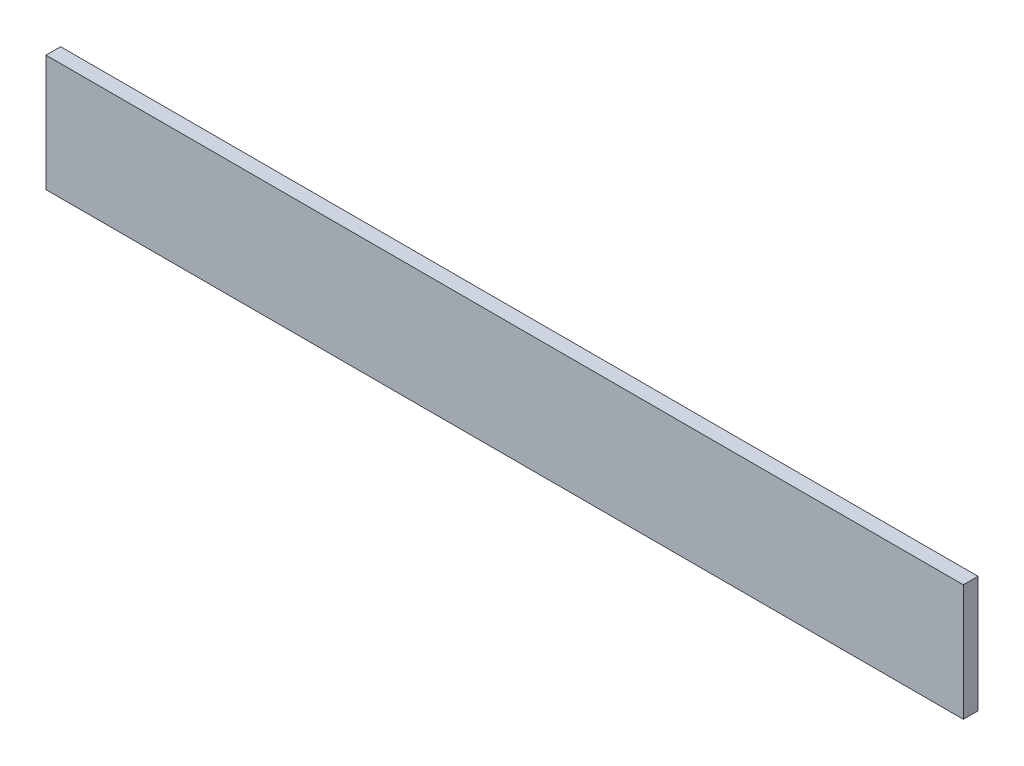
ISO-10303-21;
HEADER;
FILE_DESCRIPTION(('STEP AP214'),'2;1');
FILE_NAME('part.step','',(''),(''),'','','');
FILE_SCHEMA(('AUTOMOTIVE_DESIGN { 1 0 10303 214 1 1 1 1 }'));
ENDSEC;
DATA;
#1=APPLICATION_CONTEXT('core data for automotive mechanical design processes');
#2=APPLICATION_PROTOCOL_DEFINITION('international standard','automotive_design',2000,#1);
#3=PRODUCT_CONTEXT('',#1,'mechanical');
#4=PRODUCT('Part','Part','',(#3));
#5=PRODUCT_RELATED_PRODUCT_CATEGORY('part','',(#4));
#6=PRODUCT_DEFINITION_FORMATION('','',#4);
#7=PRODUCT_DEFINITION_CONTEXT('part definition',#1,'design');
#8=PRODUCT_DEFINITION('design','',#6,#7);
#9=PRODUCT_DEFINITION_SHAPE('','',#8);
#10=(LENGTH_UNIT() NAMED_UNIT(*) SI_UNIT(.MILLI.,.METRE.));
#11=(NAMED_UNIT(*) PLANE_ANGLE_UNIT() SI_UNIT($,.RADIAN.));
#12=(NAMED_UNIT(*) SI_UNIT($,.STERADIAN.) SOLID_ANGLE_UNIT());
#13=UNCERTAINTY_MEASURE_WITH_UNIT(LENGTH_MEASURE(1.E-05),#10,'distance_accuracy_value','');
#14=(GEOMETRIC_REPRESENTATION_CONTEXT(3) GLOBAL_UNCERTAINTY_ASSIGNED_CONTEXT((#13)) GLOBAL_UNIT_ASSIGNED_CONTEXT((#10,
#11,#12)) REPRESENTATION_CONTEXT('',''));
#15=CARTESIAN_POINT('',(0.,0.,0.));
#16=DIRECTION('',(0.,0.,1.));
#17=DIRECTION('',(1.,0.,0.));
#18=AXIS2_PLACEMENT_3D('',#15,#16,#17);
#19=CARTESIAN_POINT('',(50.,0.,0.));
#20=DIRECTION('',(0.,0.,-1.));
#21=DIRECTION('',(-1.,0.,0.));
#22=AXIS2_PLACEMENT_3D('',#19,#20,#21);
#23=PLANE('',#22);
#24=DIRECTION('',(0.,-1.,0.));
#25=VECTOR('',#24,1.);
#26=CARTESIAN_POINT('',(0.,0.,0.));
#27=LINE('',#26,#25);
#28=CARTESIAN_POINT('',(0.,6.35,0.));
#29=VERTEX_POINT('',#28);
#30=CARTESIAN_POINT('',(0.,0.,0.));
#31=VERTEX_POINT('',#30);
#32=EDGE_CURVE('E95',#29,#31,#27,.T.);
#33=ORIENTED_EDGE('',*,*,#32,.T.);
#34=DIRECTION('',(-1.,0.,0.));
#35=VECTOR('',#34,1.);
#36=CARTESIAN_POINT('',(50.,0.,0.));
#37=LINE('',#36,#35);
#38=CARTESIAN_POINT('',(50.,0.,0.));
#39=VERTEX_POINT('',#38);
#40=EDGE_CURVE('E11',#39,#31,#37,.T.);
#41=ORIENTED_EDGE('',*,*,#40,.F.);
#42=DIRECTION('',(0.,-1.,0.));
#43=VECTOR('',#42,1.);
#44=CARTESIAN_POINT('',(50.,0.,0.));
#45=LINE('',#44,#43);
#46=CARTESIAN_POINT('',(50.,6.35,0.));
#47=VERTEX_POINT('',#46);
#48=EDGE_CURVE('E83',#47,#39,#45,.T.);
#49=ORIENTED_EDGE('',*,*,#48,.F.);
#50=DIRECTION('',(-1.,0.,0.));
#51=VECTOR('',#50,1.);
#52=CARTESIAN_POINT('',(50.,6.35,0.));
#53=LINE('',#52,#51);
#54=EDGE_CURVE('E91',#47,#29,#53,.T.);
#55=ORIENTED_EDGE('',*,*,#54,.T.);
#56=EDGE_LOOP('',(#33,#41,#49,#55));
#57=FACE_BOUND('',#56,.T.);
#58=ADVANCED_FACE('F32',(#57),#23,.F.);
#59=CARTESIAN_POINT('',(50.,0.,0.));
#60=DIRECTION('',(0.,1.,0.));
#61=DIRECTION('',(0.,0.,1.));
#62=AXIS2_PLACEMENT_3D('',#59,#60,#61);
#63=PLANE('',#62);
#64=DIRECTION('',(0.,0.,-1.));
#65=VECTOR('',#64,1.);
#66=CARTESIAN_POINT('',(0.,0.,0.));
#67=LINE('',#66,#65);
#68=CARTESIAN_POINT('',(0.,0.,-0.8));
#69=VERTEX_POINT('',#68);
#70=EDGE_CURVE('E87',#31,#69,#67,.T.);
#71=ORIENTED_EDGE('',*,*,#70,.T.);
#72=DIRECTION('',(-1.,0.,0.));
#73=VECTOR('',#72,1.);
#74=CARTESIAN_POINT('',(50.,0.,-0.8));
#75=LINE('',#74,#73);
#76=CARTESIAN_POINT('',(50.,0.,-0.8));
#77=VERTEX_POINT('',#76);
#78=EDGE_CURVE('E40',#77,#69,#75,.T.);
#79=ORIENTED_EDGE('',*,*,#78,.F.);
#80=DIRECTION('',(0.,0.,-1.));
#81=VECTOR('',#80,1.);
#82=CARTESIAN_POINT('',(50.,0.,0.));
#83=LINE('',#82,#81);
#84=EDGE_CURVE('E78',#39,#77,#83,.T.);
#85=ORIENTED_EDGE('',*,*,#84,.F.);
#86=ORIENTED_EDGE('',*,*,#40,.T.);
#87=EDGE_LOOP('',(#71,#79,#85,#86));
#88=FACE_BOUND('',#87,.T.);
#89=ADVANCED_FACE('F86',(#88),#63,.F.);
#90=CARTESIAN_POINT('',(50.,0.,-0.8));
#91=DIRECTION('',(0.,0.,1.));
#92=DIRECTION('',(1.,0.,0.));
#93=AXIS2_PLACEMENT_3D('',#90,#91,#92);
#94=PLANE('',#93);
#95=DIRECTION('',(0.,1.,0.));
#96=VECTOR('',#95,1.);
#97=CARTESIAN_POINT('',(0.,0.,-0.8));
#98=LINE('',#97,#96);
#99=CARTESIAN_POINT('',(0.,6.35,-0.8));
#100=VERTEX_POINT('',#99);
#101=EDGE_CURVE('E65',#69,#100,#98,.T.);
#102=ORIENTED_EDGE('',*,*,#101,.T.);
#103=DIRECTION('',(-1.,0.,0.));
#104=VECTOR('',#103,1.);
#105=CARTESIAN_POINT('',(50.,6.35,-0.8));
#106=LINE('',#105,#104);
#107=CARTESIAN_POINT('',(50.,6.35,-0.8));
#108=VERTEX_POINT('',#107);
#109=EDGE_CURVE('E88',#108,#100,#106,.T.);
#110=ORIENTED_EDGE('',*,*,#109,.F.);
#111=DIRECTION('',(0.,1.,0.));
#112=VECTOR('',#111,1.);
#113=CARTESIAN_POINT('',(50.,0.,-0.8));
#114=LINE('',#113,#112);
#115=EDGE_CURVE('E81',#77,#108,#114,.T.);
#116=ORIENTED_EDGE('',*,*,#115,.F.);
#117=ORIENTED_EDGE('',*,*,#78,.T.);
#118=EDGE_LOOP('',(#102,#110,#116,#117));
#119=FACE_BOUND('',#118,.T.);
#120=ADVANCED_FACE('F89',(#119),#94,.F.);
#121=CARTESIAN_POINT('',(50.,6.35,0.));
#122=DIRECTION('',(0.,-1.,0.));
#123=DIRECTION('',(0.,0.,-1.));
#124=AXIS2_PLACEMENT_3D('',#121,#122,#123);
#125=PLANE('',#124);
#126=DIRECTION('',(0.,0.,1.));
#127=VECTOR('',#126,1.);
#128=CARTESIAN_POINT('',(0.,6.35,0.));
#129=LINE('',#128,#127);
#130=EDGE_CURVE('E71',#100,#29,#129,.T.);
#131=ORIENTED_EDGE('',*,*,#130,.T.);
#132=ORIENTED_EDGE('',*,*,#54,.F.);
#133=DIRECTION('',(0.,0.,1.));
#134=VECTOR('',#133,1.);
#135=CARTESIAN_POINT('',(50.,6.35,0.));
#136=LINE('',#135,#134);
#137=EDGE_CURVE('E48',#108,#47,#136,.T.);
#138=ORIENTED_EDGE('',*,*,#137,.F.);
#139=ORIENTED_EDGE('',*,*,#109,.T.);
#140=EDGE_LOOP('',(#131,#132,#138,#139));
#141=FACE_BOUND('',#140,.T.);
#142=ADVANCED_FACE('F102',(#141),#125,.F.);
#143=CARTESIAN_POINT('',(50.,0.,0.));
#144=DIRECTION('',(-1.,0.,0.));
#145=DIRECTION('',(0.,0.,1.));
#146=AXIS2_PLACEMENT_3D('',#143,#144,#145);
#147=PLANE('',#146);
#148=ORIENTED_EDGE('',*,*,#48,.T.);
#149=ORIENTED_EDGE('',*,*,#84,.T.);
#150=ORIENTED_EDGE('',*,*,#115,.T.);
#151=ORIENTED_EDGE('',*,*,#137,.T.);
#152=EDGE_LOOP('',(#148,#149,#150,#151));
#153=FACE_BOUND('',#152,.T.);
#154=ADVANCED_FACE('F79',(#153),#147,.F.);
#155=CARTESIAN_POINT('',(0.,0.,0.));
#156=DIRECTION('',(-1.,0.,0.));
#157=DIRECTION('',(0.,0.,1.));
#158=AXIS2_PLACEMENT_3D('',#155,#156,#157);
#159=PLANE('',#158);
#160=ORIENTED_EDGE('',*,*,#32,.F.);
#161=ORIENTED_EDGE('',*,*,#130,.F.);
#162=ORIENTED_EDGE('',*,*,#101,.F.);
#163=ORIENTED_EDGE('',*,*,#70,.F.);
#164=EDGE_LOOP('',(#160,#161,#162,#163));
#165=FACE_BOUND('',#164,.T.);
#166=ADVANCED_FACE('F105',(#165),#159,.T.);
#167=CLOSED_SHELL('',(#58,#89,#120,#142,#154,#166));
#168=MANIFOLD_SOLID_BREP('B2',#167);
#169=ADVANCED_BREP_SHAPE_REPRESENTATION('',(#18,#168),#14);
#170=SHAPE_DEFINITION_REPRESENTATION(#9,#169);
ENDSEC;
END-ISO-10303-21;
